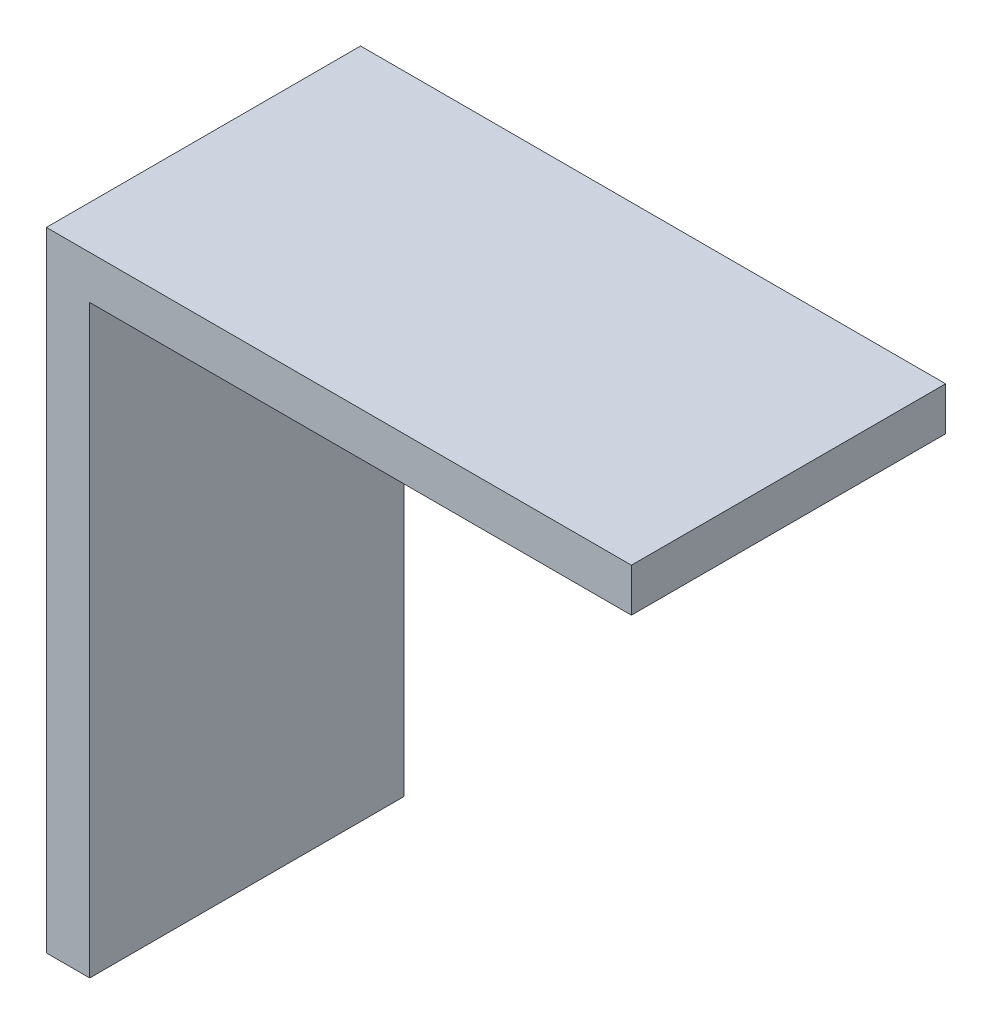
ISO-10303-21;
HEADER;
FILE_DESCRIPTION(('STEP AP214'),'2;1');
FILE_NAME('part.step','',(''),(''),'','','');
FILE_SCHEMA(('AUTOMOTIVE_DESIGN { 1 0 10303 214 1 1 1 1 }'));
ENDSEC;
DATA;
#1=APPLICATION_CONTEXT('core data for automotive mechanical design processes');
#2=APPLICATION_PROTOCOL_DEFINITION('international standard','automotive_design',2000,#1);
#3=PRODUCT_CONTEXT('',#1,'mechanical');
#4=PRODUCT('Part','Part','',(#3));
#5=PRODUCT_RELATED_PRODUCT_CATEGORY('part','',(#4));
#6=PRODUCT_DEFINITION_FORMATION('','',#4);
#7=PRODUCT_DEFINITION_CONTEXT('part definition',#1,'design');
#8=PRODUCT_DEFINITION('design','',#6,#7);
#9=PRODUCT_DEFINITION_SHAPE('','',#8);
#10=(LENGTH_UNIT() NAMED_UNIT(*) SI_UNIT(.MILLI.,.METRE.));
#11=(NAMED_UNIT(*) PLANE_ANGLE_UNIT() SI_UNIT($,.RADIAN.));
#12=(NAMED_UNIT(*) SI_UNIT($,.STERADIAN.) SOLID_ANGLE_UNIT());
#13=UNCERTAINTY_MEASURE_WITH_UNIT(LENGTH_MEASURE(1.E-05),#10,'distance_accuracy_value','');
#14=(GEOMETRIC_REPRESENTATION_CONTEXT(3) GLOBAL_UNCERTAINTY_ASSIGNED_CONTEXT((#13)) GLOBAL_UNIT_ASSIGNED_CONTEXT((#10,
#11,#12)) REPRESENTATION_CONTEXT('',''));
#15=CARTESIAN_POINT('',(0.,0.,0.));
#16=DIRECTION('',(0.,0.,1.));
#17=DIRECTION('',(1.,0.,0.));
#18=AXIS2_PLACEMENT_3D('',#15,#16,#17);
#19=CARTESIAN_POINT('',(2.,0.,14.5));
#20=DIRECTION('',(0.,1.,0.));
#21=DIRECTION('',(-1.,0.,0.));
#22=AXIS2_PLACEMENT_3D('',#19,#20,#21);
#23=PLANE('',#22);
#24=DIRECTION('',(1.,0.,0.));
#25=VECTOR('',#24,1.);
#26=CARTESIAN_POINT('',(2.,0.,0.));
#27=LINE('',#26,#25);
#28=CARTESIAN_POINT('',(0.,0.,0.));
#29=VERTEX_POINT('',#28);
#30=CARTESIAN_POINT('',(2.,0.,0.));
#31=VERTEX_POINT('',#30);
#32=EDGE_CURVE('E129',#29,#31,#27,.T.);
#33=ORIENTED_EDGE('',*,*,#32,.T.);
#34=DIRECTION('',(0.,0.,-1.));
#35=VECTOR('',#34,1.);
#36=CARTESIAN_POINT('',(2.,0.,14.5));
#37=LINE('',#36,#35);
#38=CARTESIAN_POINT('',(2.,0.,14.5));
#39=VERTEX_POINT('',#38);
#40=EDGE_CURVE('E11',#39,#31,#37,.T.);
#41=ORIENTED_EDGE('',*,*,#40,.F.);
#42=DIRECTION('',(1.,0.,0.));
#43=VECTOR('',#42,1.);
#44=CARTESIAN_POINT('',(2.,0.,14.5));
#45=LINE('',#44,#43);
#46=CARTESIAN_POINT('',(0.,0.,14.5));
#47=VERTEX_POINT('',#46);
#48=EDGE_CURVE('E145',#47,#39,#45,.T.);
#49=ORIENTED_EDGE('',*,*,#48,.F.);
#50=DIRECTION('',(0.,0.,-1.));
#51=VECTOR('',#50,1.);
#52=CARTESIAN_POINT('',(0.,0.,14.5));
#53=LINE('',#52,#51);
#54=EDGE_CURVE('E125',#47,#29,#53,.T.);
#55=ORIENTED_EDGE('',*,*,#54,.T.);
#56=EDGE_LOOP('',(#33,#41,#49,#55));
#57=FACE_BOUND('',#56,.T.);
#58=ADVANCED_FACE('F39',(#57),#23,.F.);
#59=CARTESIAN_POINT('',(2.,27.,14.5));
#60=DIRECTION('',(-1.,0.,0.));
#61=DIRECTION('',(0.,-1.,0.));
#62=AXIS2_PLACEMENT_3D('',#59,#60,#61);
#63=PLANE('',#62);
#64=DIRECTION('',(0.,1.,0.));
#65=VECTOR('',#64,1.);
#66=CARTESIAN_POINT('',(2.,27.,0.));
#67=LINE('',#66,#65);
#68=CARTESIAN_POINT('',(2.,27.,0.));
#69=VERTEX_POINT('',#68);
#70=EDGE_CURVE('E133',#31,#69,#67,.T.);
#71=ORIENTED_EDGE('',*,*,#70,.T.);
#72=DIRECTION('',(0.,0.,-1.));
#73=VECTOR('',#72,1.);
#74=CARTESIAN_POINT('',(2.,27.,14.5));
#75=LINE('',#74,#73);
#76=CARTESIAN_POINT('',(2.,27.,14.5));
#77=VERTEX_POINT('',#76);
#78=EDGE_CURVE('E48',#77,#69,#75,.T.);
#79=ORIENTED_EDGE('',*,*,#78,.F.);
#80=DIRECTION('',(0.,1.,0.));
#81=VECTOR('',#80,1.);
#82=CARTESIAN_POINT('',(2.,27.,14.5));
#83=LINE('',#82,#81);
#84=EDGE_CURVE('E93',#39,#77,#83,.T.);
#85=ORIENTED_EDGE('',*,*,#84,.F.);
#86=ORIENTED_EDGE('',*,*,#40,.T.);
#87=EDGE_LOOP('',(#71,#79,#85,#86));
#88=FACE_BOUND('',#87,.T.);
#89=ADVANCED_FACE('F173',(#88),#63,.F.);
#90=CARTESIAN_POINT('',(27.,27.,14.5));
#91=DIRECTION('',(0.,1.,0.));
#92=DIRECTION('',(-1.,0.,0.));
#93=AXIS2_PLACEMENT_3D('',#90,#91,#92);
#94=PLANE('',#93);
#95=DIRECTION('',(1.,0.,0.));
#96=VECTOR('',#95,1.);
#97=CARTESIAN_POINT('',(27.,27.,0.));
#98=LINE('',#97,#96);
#99=CARTESIAN_POINT('',(27.,27.,0.));
#100=VERTEX_POINT('',#99);
#101=EDGE_CURVE('E136',#69,#100,#98,.T.);
#102=ORIENTED_EDGE('',*,*,#101,.T.);
#103=DIRECTION('',(0.,0.,-1.));
#104=VECTOR('',#103,1.);
#105=CARTESIAN_POINT('',(27.,27.,14.5));
#106=LINE('',#105,#104);
#107=CARTESIAN_POINT('',(27.,27.,14.5));
#108=VERTEX_POINT('',#107);
#109=EDGE_CURVE('E117',#108,#100,#106,.T.);
#110=ORIENTED_EDGE('',*,*,#109,.F.);
#111=DIRECTION('',(1.,0.,0.));
#112=VECTOR('',#111,1.);
#113=CARTESIAN_POINT('',(27.,27.,14.5));
#114=LINE('',#113,#112);
#115=EDGE_CURVE('E106',#77,#108,#114,.T.);
#116=ORIENTED_EDGE('',*,*,#115,.F.);
#117=ORIENTED_EDGE('',*,*,#78,.T.);
#118=EDGE_LOOP('',(#102,#110,#116,#117));
#119=FACE_BOUND('',#118,.T.);
#120=ADVANCED_FACE('F155',(#119),#94,.F.);
#121=CARTESIAN_POINT('',(27.,29.,14.5));
#122=DIRECTION('',(-1.,0.,0.));
#123=DIRECTION('',(0.,-1.,0.));
#124=AXIS2_PLACEMENT_3D('',#121,#122,#123);
#125=PLANE('',#124);
#126=DIRECTION('',(0.,1.,0.));
#127=VECTOR('',#126,1.);
#128=CARTESIAN_POINT('',(27.,29.,0.));
#129=LINE('',#128,#127);
#130=CARTESIAN_POINT('',(27.,29.,0.));
#131=VERTEX_POINT('',#130);
#132=EDGE_CURVE('E115',#100,#131,#129,.T.);
#133=ORIENTED_EDGE('',*,*,#132,.T.);
#134=DIRECTION('',(0.,0.,-1.));
#135=VECTOR('',#134,1.);
#136=CARTESIAN_POINT('',(27.,29.,14.5));
#137=LINE('',#136,#135);
#138=CARTESIAN_POINT('',(27.,29.,14.5));
#139=VERTEX_POINT('',#138);
#140=EDGE_CURVE('E112',#139,#131,#137,.T.);
#141=ORIENTED_EDGE('',*,*,#140,.F.);
#142=DIRECTION('',(0.,1.,0.));
#143=VECTOR('',#142,1.);
#144=CARTESIAN_POINT('',(27.,29.,14.5));
#145=LINE('',#144,#143);
#146=EDGE_CURVE('E100',#108,#139,#145,.T.);
#147=ORIENTED_EDGE('',*,*,#146,.F.);
#148=ORIENTED_EDGE('',*,*,#109,.T.);
#149=EDGE_LOOP('',(#133,#141,#147,#148));
#150=FACE_BOUND('',#149,.T.);
#151=ADVANCED_FACE('F113',(#150),#125,.F.);
#152=CARTESIAN_POINT('',(0.,29.,14.5));
#153=DIRECTION('',(0.,-1.,0.));
#154=DIRECTION('',(0.,0.,-1.));
#155=AXIS2_PLACEMENT_3D('',#152,#153,#154);
#156=PLANE('',#155);
#157=DIRECTION('',(-1.,0.,0.));
#158=VECTOR('',#157,1.);
#159=CARTESIAN_POINT('',(0.,29.,0.));
#160=LINE('',#159,#158);
#161=CARTESIAN_POINT('',(0.,29.,0.));
#162=VERTEX_POINT('',#161);
#163=EDGE_CURVE('E79',#131,#162,#160,.T.);
#164=ORIENTED_EDGE('',*,*,#163,.T.);
#165=DIRECTION('',(0.,0.,-1.));
#166=VECTOR('',#165,1.);
#167=CARTESIAN_POINT('',(0.,29.,14.5));
#168=LINE('',#167,#166);
#169=CARTESIAN_POINT('',(0.,29.,14.5));
#170=VERTEX_POINT('',#169);
#171=EDGE_CURVE('E118',#170,#162,#168,.T.);
#172=ORIENTED_EDGE('',*,*,#171,.F.);
#173=DIRECTION('',(-1.,0.,0.));
#174=VECTOR('',#173,1.);
#175=CARTESIAN_POINT('',(0.,29.,14.5));
#176=LINE('',#175,#174);
#177=EDGE_CURVE('E104',#139,#170,#176,.T.);
#178=ORIENTED_EDGE('',*,*,#177,.F.);
#179=ORIENTED_EDGE('',*,*,#140,.T.);
#180=EDGE_LOOP('',(#164,#172,#178,#179));
#181=FACE_BOUND('',#180,.T.);
#182=ADVANCED_FACE('F120',(#181),#156,.F.);
#183=CARTESIAN_POINT('',(0.,0.,14.5));
#184=DIRECTION('',(1.,0.,0.));
#185=DIRECTION('',(0.,0.,-1.));
#186=AXIS2_PLACEMENT_3D('',#183,#184,#185);
#187=PLANE('',#186);
#188=DIRECTION('',(0.,-1.,0.));
#189=VECTOR('',#188,1.);
#190=CARTESIAN_POINT('',(0.,0.,0.));
#191=LINE('',#190,#189);
#192=EDGE_CURVE('E85',#162,#29,#191,.T.);
#193=ORIENTED_EDGE('',*,*,#192,.T.);
#194=ORIENTED_EDGE('',*,*,#54,.F.);
#195=DIRECTION('',(0.,-1.,0.));
#196=VECTOR('',#195,1.);
#197=CARTESIAN_POINT('',(0.,0.,14.5));
#198=LINE('',#197,#196);
#199=EDGE_CURVE('E56',#170,#47,#198,.T.);
#200=ORIENTED_EDGE('',*,*,#199,.F.);
#201=ORIENTED_EDGE('',*,*,#171,.T.);
#202=EDGE_LOOP('',(#193,#194,#200,#201));
#203=FACE_BOUND('',#202,.T.);
#204=ADVANCED_FACE('F162',(#203),#187,.F.);
#205=CARTESIAN_POINT('',(0.,0.,14.5));
#206=DIRECTION('',(0.,0.,-1.));
#207=DIRECTION('',(-1.,0.,0.));
#208=AXIS2_PLACEMENT_3D('',#205,#206,#207);
#209=PLANE('',#208);
#210=ORIENTED_EDGE('',*,*,#48,.T.);
#211=ORIENTED_EDGE('',*,*,#84,.T.);
#212=ORIENTED_EDGE('',*,*,#115,.T.);
#213=ORIENTED_EDGE('',*,*,#146,.T.);
#214=ORIENTED_EDGE('',*,*,#177,.T.);
#215=ORIENTED_EDGE('',*,*,#199,.T.);
#216=EDGE_LOOP('',(#210,#211,#212,#213,#214,#215));
#217=FACE_BOUND('',#216,.T.);
#218=ADVANCED_FACE('F102',(#217),#209,.F.);
#219=CARTESIAN_POINT('',(0.,0.,0.));
#220=DIRECTION('',(0.,0.,-1.));
#221=DIRECTION('',(-1.,0.,0.));
#222=AXIS2_PLACEMENT_3D('',#219,#220,#221);
#223=PLANE('',#222);
#224=ORIENTED_EDGE('',*,*,#32,.F.);
#225=ORIENTED_EDGE('',*,*,#192,.F.);
#226=ORIENTED_EDGE('',*,*,#163,.F.);
#227=ORIENTED_EDGE('',*,*,#132,.F.);
#228=ORIENTED_EDGE('',*,*,#101,.F.);
#229=ORIENTED_EDGE('',*,*,#70,.F.);
#230=EDGE_LOOP('',(#224,#225,#226,#227,#228,#229));
#231=FACE_BOUND('',#230,.T.);
#232=ADVANCED_FACE('F158',(#231),#223,.T.);
#233=CLOSED_SHELL('',(#58,#89,#120,#151,#182,#204,#218,#232));
#234=MANIFOLD_SOLID_BREP('B2',#233);
#235=ADVANCED_BREP_SHAPE_REPRESENTATION('',(#18,#234),#14);
#236=SHAPE_DEFINITION_REPRESENTATION(#9,#235);
ENDSEC;
END-ISO-10303-21;
